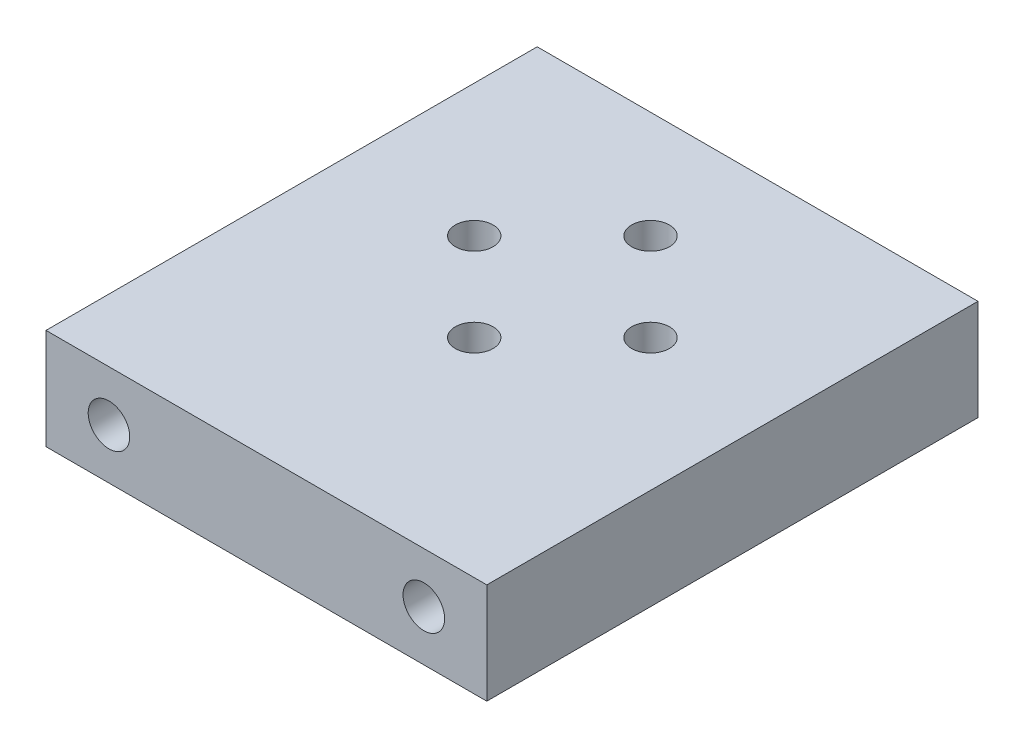
ISO-10303-21;
HEADER;
FILE_DESCRIPTION(('STEP AP214'),'2;1');
FILE_NAME('part.step','',(''),(''),'','','');
FILE_SCHEMA(('AUTOMOTIVE_DESIGN { 1 0 10303 214 1 1 1 1 }'));
ENDSEC;
DATA;
#1=APPLICATION_CONTEXT('core data for automotive mechanical design processes');
#2=APPLICATION_PROTOCOL_DEFINITION('international standard','automotive_design',2000,#1);
#3=PRODUCT_CONTEXT('',#1,'mechanical');
#4=PRODUCT('Part','Part','',(#3));
#5=PRODUCT_RELATED_PRODUCT_CATEGORY('part','',(#4));
#6=PRODUCT_DEFINITION_FORMATION('','',#4);
#7=PRODUCT_DEFINITION_CONTEXT('part definition',#1,'design');
#8=PRODUCT_DEFINITION('design','',#6,#7);
#9=PRODUCT_DEFINITION_SHAPE('','',#8);
#10=(LENGTH_UNIT() NAMED_UNIT(*) SI_UNIT(.MILLI.,.METRE.));
#11=(NAMED_UNIT(*) PLANE_ANGLE_UNIT() SI_UNIT($,.RADIAN.));
#12=(NAMED_UNIT(*) SI_UNIT($,.STERADIAN.) SOLID_ANGLE_UNIT());
#13=UNCERTAINTY_MEASURE_WITH_UNIT(LENGTH_MEASURE(1.E-05),#10,'distance_accuracy_value','');
#14=(GEOMETRIC_REPRESENTATION_CONTEXT(3) GLOBAL_UNCERTAINTY_ASSIGNED_CONTEXT((#13)) GLOBAL_UNIT_ASSIGNED_CONTEXT((#10,
#11,#12)) REPRESENTATION_CONTEXT('',''));
#15=CARTESIAN_POINT('',(0.,0.,0.));
#16=DIRECTION('',(0.,0.,1.));
#17=DIRECTION('',(1.,0.,0.));
#18=AXIS2_PLACEMENT_3D('',#15,#16,#17);
#19=CARTESIAN_POINT('',(0.,5.,-4.));
#20=DIRECTION('',(0.,1.,0.));
#21=DIRECTION('',(0.,0.,1.));
#22=AXIS2_PLACEMENT_3D('',#19,#20,#21);
#23=PLANE('',#22);
#24=CARTESIAN_POINT('',(0.,5.,-11.));
#25=DIRECTION('',(0.,-1.,0.));
#26=DIRECTION('',(0.,0.,-1.));
#27=AXIS2_PLACEMENT_3D('',#24,#25,#26);
#28=CIRCLE('',#27,1.5);
#29=CARTESIAN_POINT('',(1.5,5.,-11.));
#30=VERTEX_POINT('',#29);
#31=CARTESIAN_POINT('',(-1.5,5.,-11.));
#32=VERTEX_POINT('',#31);
#33=EDGE_CURVE('E314',#30,#32,#28,.T.);
#34=ORIENTED_EDGE('',*,*,#33,.F.);
#35=DIRECTION('',(0.,0.,1.));
#36=VECTOR('',#35,1.);
#37=CARTESIAN_POINT('',(1.5,5.,-11.));
#38=LINE('',#37,#36);
#39=CARTESIAN_POINT('',(1.5,5.,-9.29150262212918));
#40=VERTEX_POINT('',#39);
#41=EDGE_CURVE('E428',#30,#40,#38,.T.);
#42=ORIENTED_EDGE('',*,*,#41,.T.);
#43=CARTESIAN_POINT('',(0.,5.,-4.));
#44=DIRECTION('',(0.,1.,0.));
#45=DIRECTION('',(0.,0.,1.));
#46=AXIS2_PLACEMENT_3D('',#43,#44,#45);
#47=CIRCLE('',#46,5.5);
#48=CARTESIAN_POINT('',(5.29150262212917,5.,-5.50000000000006));
#49=VERTEX_POINT('',#48);
#50=EDGE_CURVE('E267',#49,#40,#47,.T.);
#51=ORIENTED_EDGE('',*,*,#50,.F.);
#52=DIRECTION('',(1.,0.,0.));
#53=VECTOR('',#52,1.);
#54=CARTESIAN_POINT('',(6.99999999999998,5.,-5.50000000000007));
#55=LINE('',#54,#53);
#56=CARTESIAN_POINT('',(6.99999999999998,5.,-5.50000000000007));
#57=VERTEX_POINT('',#56);
#58=EDGE_CURVE('E230',#49,#57,#55,.T.);
#59=ORIENTED_EDGE('',*,*,#58,.T.);
#60=CARTESIAN_POINT('',(7.,5.,-4.00000000000007));
#61=DIRECTION('',(0.,-1.,0.));
#62=DIRECTION('',(0.,0.,-1.));
#63=AXIS2_PLACEMENT_3D('',#60,#61,#62);
#64=CIRCLE('',#63,1.5);
#65=CARTESIAN_POINT('',(7.00000000000002,5.,-2.50000000000007));
#66=VERTEX_POINT('',#65);
#67=EDGE_CURVE('E425',#66,#57,#64,.T.);
#68=ORIENTED_EDGE('',*,*,#67,.F.);
#69=DIRECTION('',(-1.,0.,0.));
#70=VECTOR('',#69,1.);
#71=CARTESIAN_POINT('',(7.00000000000002,5.,-2.50000000000007));
#72=LINE('',#71,#70);
#73=CARTESIAN_POINT('',(5.2915026221292,5.,-2.50000000000006));
#74=VERTEX_POINT('',#73);
#75=EDGE_CURVE('E228',#66,#74,#72,.T.);
#76=ORIENTED_EDGE('',*,*,#75,.T.);
#77=CARTESIAN_POINT('',(1.50000000000004,5.,1.29150262212917));
#78=VERTEX_POINT('',#77);
#79=EDGE_CURVE('E263',#78,#74,#47,.T.);
#80=ORIENTED_EDGE('',*,*,#79,.F.);
#81=DIRECTION('',(0.,0.,1.));
#82=VECTOR('',#81,1.);
#83=CARTESIAN_POINT('',(1.50000000000005,5.,2.99999999999999));
#84=LINE('',#83,#82);
#85=CARTESIAN_POINT('',(1.50000000000005,5.,2.99999999999999));
#86=VERTEX_POINT('',#85);
#87=EDGE_CURVE('E213',#78,#86,#84,.T.);
#88=ORIENTED_EDGE('',*,*,#87,.T.);
#89=CARTESIAN_POINT('',(0.,5.,3.));
#90=DIRECTION('',(0.,-1.,0.));
#91=DIRECTION('',(0.,0.,-1.));
#92=AXIS2_PLACEMENT_3D('',#89,#90,#91);
#93=CIRCLE('',#92,1.5);
#94=CARTESIAN_POINT('',(-1.49999999999995,5.,3.00000000000001));
#95=VERTEX_POINT('',#94);
#96=EDGE_CURVE('E181',#95,#86,#93,.T.);
#97=ORIENTED_EDGE('',*,*,#96,.F.);
#98=DIRECTION('',(0.,0.,-1.));
#99=VECTOR('',#98,1.);
#100=CARTESIAN_POINT('',(-1.49999999999995,5.,3.00000000000001));
#101=LINE('',#100,#99);
#102=CARTESIAN_POINT('',(-1.49999999999996,5.,1.29150262212919));
#103=VERTEX_POINT('',#102);
#104=EDGE_CURVE('E54',#95,#103,#101,.T.);
#105=ORIENTED_EDGE('',*,*,#104,.T.);
#106=CARTESIAN_POINT('',(-5.29150262212918,5.,-2.49999999999998));
#107=VERTEX_POINT('',#106);
#108=EDGE_CURVE('E268',#107,#103,#47,.T.);
#109=ORIENTED_EDGE('',*,*,#108,.F.);
#110=DIRECTION('',(-1.,0.,0.));
#111=VECTOR('',#110,1.);
#112=CARTESIAN_POINT('',(-6.99999999999999,5.,-2.49999999999998));
#113=LINE('',#112,#111);
#114=CARTESIAN_POINT('',(-6.99999999999999,5.,-2.49999999999998));
#115=VERTEX_POINT('',#114);
#116=EDGE_CURVE('E177',#107,#115,#113,.T.);
#117=ORIENTED_EDGE('',*,*,#116,.T.);
#118=CARTESIAN_POINT('',(-7.,5.,-3.99999999999998));
#119=DIRECTION('',(0.,-1.,0.));
#120=DIRECTION('',(0.,0.,-1.));
#121=AXIS2_PLACEMENT_3D('',#118,#119,#120);
#122=CIRCLE('',#121,1.5);
#123=CARTESIAN_POINT('',(-7.,5.,-5.49999999999998));
#124=VERTEX_POINT('',#123);
#125=EDGE_CURVE('E175',#124,#115,#122,.T.);
#126=ORIENTED_EDGE('',*,*,#125,.F.);
#127=DIRECTION('',(1.,0.,0.));
#128=VECTOR('',#127,1.);
#129=CARTESIAN_POINT('',(-7.,5.,-5.49999999999998));
#130=LINE('',#129,#128);
#131=CARTESIAN_POINT('',(-5.29150262212919,5.,-5.49999999999998));
#132=VERTEX_POINT('',#131);
#133=EDGE_CURVE('E61',#124,#132,#130,.T.);
#134=ORIENTED_EDGE('',*,*,#133,.T.);
#135=CARTESIAN_POINT('',(-1.5,5.,-9.29150262212918));
#136=VERTEX_POINT('',#135);
#137=EDGE_CURVE('E490',#136,#132,#47,.T.);
#138=ORIENTED_EDGE('',*,*,#137,.F.);
#139=DIRECTION('',(0.,0.,-1.));
#140=VECTOR('',#139,1.);
#141=CARTESIAN_POINT('',(-1.5,5.,-11.));
#142=LINE('',#141,#140);
#143=EDGE_CURVE('E430',#136,#32,#142,.T.);
#144=ORIENTED_EDGE('',*,*,#143,.T.);
#145=EDGE_LOOP('',(#34,#42,#51,#59,#68,#76,#80,#88,#97,#105,#109,#117,#126,#134,#138,#144));
#146=FACE_BOUND('',#145,.T.);
#147=ADVANCED_FACE('F37',(#146),#23,.F.);
#148=CARTESIAN_POINT('',(0.,5.,-4.));
#149=DIRECTION('',(0.,-1.,0.));
#150=DIRECTION('',(0.,0.,-1.));
#151=AXIS2_PLACEMENT_3D('',#148,#149,#150);
#152=CYLINDRICAL_SURFACE('',#151,5.5);
#153=DIRECTION('',(0.,-1.,0.));
#154=VECTOR('',#153,1.);
#155=CARTESIAN_POINT('',(-1.5,5.,-9.29150262212918));
#156=LINE('',#155,#154);
#157=CARTESIAN_POINT('',(-1.5,0.,-9.29150262212918));
#158=VERTEX_POINT('',#157);
#159=EDGE_CURVE('E260',#136,#158,#156,.T.);
#160=ORIENTED_EDGE('',*,*,#159,.F.);
#161=ORIENTED_EDGE('',*,*,#137,.T.);
#162=DIRECTION('',(0.,-1.,0.));
#163=VECTOR('',#162,1.);
#164=CARTESIAN_POINT('',(-5.29150262212919,5.,-5.49999999999998));
#165=LINE('',#164,#163);
#166=CARTESIAN_POINT('',(-5.29150262212919,0.,-5.49999999999998));
#167=VERTEX_POINT('',#166);
#168=EDGE_CURVE('E196',#167,#132,#165,.F.);
#169=ORIENTED_EDGE('',*,*,#168,.F.);
#170=CARTESIAN_POINT('',(0.,0.,-4.));
#171=DIRECTION('',(0.,1.,0.));
#172=DIRECTION('',(0.,0.,1.));
#173=AXIS2_PLACEMENT_3D('',#170,#171,#172);
#174=CIRCLE('',#173,5.5);
#175=EDGE_CURVE('E453',#158,#167,#174,.T.);
#176=ORIENTED_EDGE('',*,*,#175,.F.);
#177=EDGE_LOOP('',(#160,#161,#169,#176));
#178=FACE_BOUND('',#177,.T.);
#179=ADVANCED_FACE('F366',(#178),#152,.F.);
#180=DIRECTION('',(0.,-1.,0.));
#181=VECTOR('',#180,1.);
#182=CARTESIAN_POINT('',(-5.29150262212918,5.,-2.49999999999998));
#183=LINE('',#182,#181);
#184=CARTESIAN_POINT('',(-5.29150262212918,0.,-2.49999999999998));
#185=VERTEX_POINT('',#184);
#186=EDGE_CURVE('E255',#107,#185,#183,.T.);
#187=ORIENTED_EDGE('',*,*,#186,.F.);
#188=ORIENTED_EDGE('',*,*,#108,.T.);
#189=DIRECTION('',(0.,-1.,0.));
#190=VECTOR('',#189,1.);
#191=CARTESIAN_POINT('',(-1.49999999999996,5.,1.29150262212919));
#192=LINE('',#191,#190);
#193=CARTESIAN_POINT('',(-1.49999999999996,0.,1.29150262212919));
#194=VERTEX_POINT('',#193);
#195=EDGE_CURVE('E250',#194,#103,#192,.F.);
#196=ORIENTED_EDGE('',*,*,#195,.F.);
#197=EDGE_CURVE('E262',#185,#194,#174,.T.);
#198=ORIENTED_EDGE('',*,*,#197,.F.);
#199=EDGE_LOOP('',(#187,#188,#196,#198));
#200=FACE_BOUND('',#199,.T.);
#201=ADVANCED_FACE('F371',(#200),#152,.F.);
#202=DIRECTION('',(0.,-1.,0.));
#203=VECTOR('',#202,1.);
#204=CARTESIAN_POINT('',(1.50000000000004,5.,1.29150262212917));
#205=LINE('',#204,#203);
#206=CARTESIAN_POINT('',(1.50000000000004,0.,1.29150262212917));
#207=VERTEX_POINT('',#206);
#208=EDGE_CURVE('E252',#78,#207,#205,.T.);
#209=ORIENTED_EDGE('',*,*,#208,.F.);
#210=ORIENTED_EDGE('',*,*,#79,.T.);
#211=DIRECTION('',(0.,-1.,0.));
#212=VECTOR('',#211,1.);
#213=CARTESIAN_POINT('',(5.2915026221292,5.,-2.50000000000006));
#214=LINE('',#213,#212);
#215=CARTESIAN_POINT('',(5.2915026221292,0.,-2.50000000000006));
#216=VERTEX_POINT('',#215);
#217=EDGE_CURVE('E244',#216,#74,#214,.F.);
#218=ORIENTED_EDGE('',*,*,#217,.F.);
#219=EDGE_CURVE('E269',#207,#216,#174,.T.);
#220=ORIENTED_EDGE('',*,*,#219,.F.);
#221=EDGE_LOOP('',(#209,#210,#218,#220));
#222=FACE_BOUND('',#221,.T.);
#223=ADVANCED_FACE('F382',(#222),#152,.F.);
#224=CARTESIAN_POINT('',(17.5,8.,-19.5));
#225=DIRECTION('',(-1.,0.,0.));
#226=DIRECTION('',(0.,0.,1.));
#227=AXIS2_PLACEMENT_3D('',#224,#225,#226);
#228=PLANE('',#227);
#229=DIRECTION('',(0.,0.,-1.));
#230=VECTOR('',#229,1.);
#231=CARTESIAN_POINT('',(17.5,0.,-19.5));
#232=LINE('',#231,#230);
#233=CARTESIAN_POINT('',(17.5,0.,19.5));
#234=VERTEX_POINT('',#233);
#235=CARTESIAN_POINT('',(17.5,0.,-19.5));
#236=VERTEX_POINT('',#235);
#237=EDGE_CURVE('E276',#234,#236,#232,.T.);
#238=ORIENTED_EDGE('',*,*,#237,.T.);
#239=DIRECTION('',(0.,-1.,0.));
#240=VECTOR('',#239,1.);
#241=CARTESIAN_POINT('',(17.5,8.,-19.5));
#242=LINE('',#241,#240);
#243=CARTESIAN_POINT('',(17.5,8.,-19.5));
#244=VERTEX_POINT('',#243);
#245=EDGE_CURVE('E11',#244,#236,#242,.T.);
#246=ORIENTED_EDGE('',*,*,#245,.F.);
#247=DIRECTION('',(0.,0.,-1.));
#248=VECTOR('',#247,1.);
#249=CARTESIAN_POINT('',(17.5,8.,-19.5));
#250=LINE('',#249,#248);
#251=CARTESIAN_POINT('',(17.5,8.,19.5));
#252=VERTEX_POINT('',#251);
#253=EDGE_CURVE('E285',#252,#244,#250,.T.);
#254=ORIENTED_EDGE('',*,*,#253,.F.);
#255=DIRECTION('',(0.,-1.,0.));
#256=VECTOR('',#255,1.);
#257=CARTESIAN_POINT('',(17.5,8.,19.5));
#258=LINE('',#257,#256);
#259=EDGE_CURVE('E295',#252,#234,#258,.T.);
#260=ORIENTED_EDGE('',*,*,#259,.T.);
#261=EDGE_LOOP('',(#238,#246,#254,#260));
#262=FACE_BOUND('',#261,.T.);
#263=ADVANCED_FACE('F39',(#262),#228,.F.);
#264=CARTESIAN_POINT('',(-17.5,8.,-19.5));
#265=DIRECTION('',(0.,0.,1.));
#266=DIRECTION('',(1.,0.,0.));
#267=AXIS2_PLACEMENT_3D('',#264,#265,#266);
#268=PLANE('',#267);
#269=CARTESIAN_POINT('',(-12.5,4.,-19.5));
#270=DIRECTION('',(0.,0.,-1.));
#271=DIRECTION('',(-1.,0.,0.));
#272=AXIS2_PLACEMENT_3D('',#269,#270,#271);
#273=CIRCLE('',#272,1.65);
#274=CARTESIAN_POINT('',(-14.15,4.,-19.5));
#275=VERTEX_POINT('',#274);
#276=EDGE_CURVE('E277',#275,#275,#273,.T.);
#277=ORIENTED_EDGE('',*,*,#276,.F.);
#278=EDGE_LOOP('',(#277));
#279=FACE_BOUND('',#278,.T.);
#280=CARTESIAN_POINT('',(12.5,3.99999999999999,-19.5));
#281=DIRECTION('',(0.,0.,-1.));
#282=DIRECTION('',(1.,0.,0.));
#283=AXIS2_PLACEMENT_3D('',#280,#281,#282);
#284=CIRCLE('',#283,1.65);
#285=CARTESIAN_POINT('',(14.15,3.99999999999999,-19.5));
#286=VERTEX_POINT('',#285);
#287=EDGE_CURVE('E266',#286,#286,#284,.T.);
#288=ORIENTED_EDGE('',*,*,#287,.F.);
#289=EDGE_LOOP('',(#288));
#290=FACE_BOUND('',#289,.T.);
#291=DIRECTION('',(-1.,0.,0.));
#292=VECTOR('',#291,1.);
#293=CARTESIAN_POINT('',(-17.5,0.,-19.5));
#294=LINE('',#293,#292);
#295=CARTESIAN_POINT('',(-17.5,0.,-19.5));
#296=VERTEX_POINT('',#295);
#297=EDGE_CURVE('E298',#236,#296,#294,.T.);
#298=ORIENTED_EDGE('',*,*,#297,.T.);
#299=DIRECTION('',(0.,-1.,0.));
#300=VECTOR('',#299,1.);
#301=CARTESIAN_POINT('',(-17.5,8.,-19.5));
#302=LINE('',#301,#300);
#303=CARTESIAN_POINT('',(-17.5,8.,-19.5));
#304=VERTEX_POINT('',#303);
#305=EDGE_CURVE('E46',#304,#296,#302,.T.);
#306=ORIENTED_EDGE('',*,*,#305,.F.);
#307=DIRECTION('',(-1.,0.,0.));
#308=VECTOR('',#307,1.);
#309=CARTESIAN_POINT('',(-17.5,8.,-19.5));
#310=LINE('',#309,#308);
#311=EDGE_CURVE('E288',#244,#304,#310,.T.);
#312=ORIENTED_EDGE('',*,*,#311,.F.);
#313=ORIENTED_EDGE('',*,*,#245,.T.);
#314=EDGE_LOOP('',(#298,#306,#312,#313));
#315=FACE_BOUND('',#314,.T.);
#316=ADVANCED_FACE('F344',(#279,#290,#315),#268,.F.);
#317=CARTESIAN_POINT('',(-17.5,8.,-19.5));
#318=DIRECTION('',(1.,0.,0.));
#319=DIRECTION('',(0.,0.,-1.));
#320=AXIS2_PLACEMENT_3D('',#317,#318,#319);
#321=PLANE('',#320);
#322=DIRECTION('',(0.,0.,1.));
#323=VECTOR('',#322,1.);
#324=CARTESIAN_POINT('',(-17.5,0.,-19.5));
#325=LINE('',#324,#323);
#326=CARTESIAN_POINT('',(-17.5,0.,19.5));
#327=VERTEX_POINT('',#326);
#328=EDGE_CURVE('E300',#296,#327,#325,.T.);
#329=ORIENTED_EDGE('',*,*,#328,.T.);
#330=DIRECTION('',(0.,-1.,0.));
#331=VECTOR('',#330,1.);
#332=CARTESIAN_POINT('',(-17.5,8.,19.5));
#333=LINE('',#332,#331);
#334=CARTESIAN_POINT('',(-17.5,8.,19.5));
#335=VERTEX_POINT('',#334);
#336=EDGE_CURVE('E305',#335,#327,#333,.T.);
#337=ORIENTED_EDGE('',*,*,#336,.F.);
#338=DIRECTION('',(0.,0.,1.));
#339=VECTOR('',#338,1.);
#340=CARTESIAN_POINT('',(-17.5,8.,-19.5));
#341=LINE('',#340,#339);
#342=EDGE_CURVE('E291',#304,#335,#341,.T.);
#343=ORIENTED_EDGE('',*,*,#342,.F.);
#344=ORIENTED_EDGE('',*,*,#305,.T.);
#345=EDGE_LOOP('',(#329,#337,#343,#344));
#346=FACE_BOUND('',#345,.T.);
#347=ADVANCED_FACE('F349',(#346),#321,.F.);
#348=CARTESIAN_POINT('',(-17.5,8.,19.5));
#349=DIRECTION('',(0.,0.,-1.));
#350=DIRECTION('',(-1.,0.,0.));
#351=AXIS2_PLACEMENT_3D('',#348,#349,#350);
#352=PLANE('',#351);
#353=CARTESIAN_POINT('',(-12.5,4.,19.5));
#354=DIRECTION('',(0.,0.,1.));
#355=DIRECTION('',(1.,0.,0.));
#356=AXIS2_PLACEMENT_3D('',#353,#354,#355);
#357=CIRCLE('',#356,1.65);
#358=CARTESIAN_POINT('',(-10.85,4.,19.5));
#359=VERTEX_POINT('',#358);
#360=EDGE_CURVE('E413',#359,#359,#357,.T.);
#361=ORIENTED_EDGE('',*,*,#360,.F.);
#362=EDGE_LOOP('',(#361));
#363=FACE_BOUND('',#362,.T.);
#364=CARTESIAN_POINT('',(12.5,4.,19.5));
#365=DIRECTION('',(0.,0.,1.));
#366=DIRECTION('',(-1.,0.,0.));
#367=AXIS2_PLACEMENT_3D('',#364,#365,#366);
#368=CIRCLE('',#367,1.65);
#369=CARTESIAN_POINT('',(10.85,4.,19.5));
#370=VERTEX_POINT('',#369);
#371=EDGE_CURVE('E416',#370,#370,#368,.T.);
#372=ORIENTED_EDGE('',*,*,#371,.F.);
#373=EDGE_LOOP('',(#372));
#374=FACE_BOUND('',#373,.T.);
#375=DIRECTION('',(1.,0.,0.));
#376=VECTOR('',#375,1.);
#377=CARTESIAN_POINT('',(-17.5,0.,19.5));
#378=LINE('',#377,#376);
#379=EDGE_CURVE('E289',#327,#234,#378,.T.);
#380=ORIENTED_EDGE('',*,*,#379,.T.);
#381=ORIENTED_EDGE('',*,*,#259,.F.);
#382=DIRECTION('',(1.,0.,0.));
#383=VECTOR('',#382,1.);
#384=CARTESIAN_POINT('',(-17.5,8.,19.5));
#385=LINE('',#384,#383);
#386=EDGE_CURVE('E293',#335,#252,#385,.T.);
#387=ORIENTED_EDGE('',*,*,#386,.F.);
#388=ORIENTED_EDGE('',*,*,#336,.T.);
#389=EDGE_LOOP('',(#380,#381,#387,#388));
#390=FACE_BOUND('',#389,.T.);
#391=ADVANCED_FACE('F329',(#363,#374,#390),#352,.F.);
#392=CARTESIAN_POINT('',(0.,8.,0.));
#393=DIRECTION('',(0.,1.,0.));
#394=DIRECTION('',(0.,0.,1.));
#395=AXIS2_PLACEMENT_3D('',#392,#393,#394);
#396=PLANE('',#395);
#397=CARTESIAN_POINT('',(0.,8.,-11.));
#398=DIRECTION('',(0.,1.,0.));
#399=DIRECTION('',(0.,0.,1.));
#400=AXIS2_PLACEMENT_3D('',#397,#398,#399);
#401=CIRCLE('',#400,1.5);
#402=CARTESIAN_POINT('',(0.,8.,-9.5));
#403=VERTEX_POINT('',#402);
#404=EDGE_CURVE('E41',#403,#403,#401,.T.);
#405=ORIENTED_EDGE('',*,*,#404,.F.);
#406=EDGE_LOOP('',(#405));
#407=FACE_BOUND('',#406,.T.);
#408=CARTESIAN_POINT('',(7.,8.,-4.00000000000007));
#409=DIRECTION('',(0.,1.,0.));
#410=DIRECTION('',(0.,0.,1.));
#411=AXIS2_PLACEMENT_3D('',#408,#409,#410);
#412=CIRCLE('',#411,1.5);
#413=CARTESIAN_POINT('',(7.,8.,-2.50000000000007));
#414=VERTEX_POINT('',#413);
#415=EDGE_CURVE('E316',#414,#414,#412,.T.);
#416=ORIENTED_EDGE('',*,*,#415,.F.);
#417=EDGE_LOOP('',(#416));
#418=FACE_BOUND('',#417,.T.);
#419=CARTESIAN_POINT('',(0.,8.,3.));
#420=DIRECTION('',(0.,1.,0.));
#421=DIRECTION('',(0.,0.,1.));
#422=AXIS2_PLACEMENT_3D('',#419,#420,#421);
#423=CIRCLE('',#422,1.5);
#424=CARTESIAN_POINT('',(0.,8.,4.5));
#425=VERTEX_POINT('',#424);
#426=EDGE_CURVE('E313',#425,#425,#423,.T.);
#427=ORIENTED_EDGE('',*,*,#426,.F.);
#428=EDGE_LOOP('',(#427));
#429=FACE_BOUND('',#428,.T.);
#430=CARTESIAN_POINT('',(-7.,8.,-3.99999999999998));
#431=DIRECTION('',(0.,1.,0.));
#432=DIRECTION('',(0.,0.,1.));
#433=AXIS2_PLACEMENT_3D('',#430,#431,#432);
#434=CIRCLE('',#433,1.5);
#435=CARTESIAN_POINT('',(-7.,8.,-2.49999999999998));
#436=VERTEX_POINT('',#435);
#437=EDGE_CURVE('E310',#436,#436,#434,.T.);
#438=ORIENTED_EDGE('',*,*,#437,.F.);
#439=EDGE_LOOP('',(#438));
#440=FACE_BOUND('',#439,.T.);
#441=ORIENTED_EDGE('',*,*,#253,.T.);
#442=ORIENTED_EDGE('',*,*,#311,.T.);
#443=ORIENTED_EDGE('',*,*,#342,.T.);
#444=ORIENTED_EDGE('',*,*,#386,.T.);
#445=EDGE_LOOP('',(#441,#442,#443,#444));
#446=FACE_BOUND('',#445,.T.);
#447=ADVANCED_FACE('F325',(#407,#418,#429,#440,#446),#396,.T.);
#448=CARTESIAN_POINT('',(0.,0.,0.));
#449=DIRECTION('',(0.,1.,0.));
#450=DIRECTION('',(0.,0.,1.));
#451=AXIS2_PLACEMENT_3D('',#448,#449,#450);
#452=PLANE('',#451);
#453=CARTESIAN_POINT('',(0.,0.,-11.));
#454=DIRECTION('',(0.,-1.,0.));
#455=DIRECTION('',(0.,0.,-1.));
#456=AXIS2_PLACEMENT_3D('',#453,#454,#455);
#457=CIRCLE('',#456,1.5);
#458=CARTESIAN_POINT('',(-1.5,0.,-11.));
#459=VERTEX_POINT('',#458);
#460=CARTESIAN_POINT('',(1.5,0.,-11.));
#461=VERTEX_POINT('',#460);
#462=EDGE_CURVE('E210',#459,#461,#457,.T.);
#463=ORIENTED_EDGE('',*,*,#462,.F.);
#464=DIRECTION('',(0.,0.,-1.));
#465=VECTOR('',#464,1.);
#466=CARTESIAN_POINT('',(-1.5,0.,-11.));
#467=LINE('',#466,#465);
#468=EDGE_CURVE('E431',#158,#459,#467,.T.);
#469=ORIENTED_EDGE('',*,*,#468,.F.);
#470=ORIENTED_EDGE('',*,*,#175,.T.);
#471=DIRECTION('',(1.,0.,0.));
#472=VECTOR('',#471,1.);
#473=CARTESIAN_POINT('',(-7.,0.,-5.49999999999998));
#474=LINE('',#473,#472);
#475=CARTESIAN_POINT('',(-7.,0.,-5.49999999999998));
#476=VERTEX_POINT('',#475);
#477=EDGE_CURVE('E201',#476,#167,#474,.T.);
#478=ORIENTED_EDGE('',*,*,#477,.F.);
#479=CARTESIAN_POINT('',(-7.,0.,-3.99999999999998));
#480=DIRECTION('',(0.,-1.,0.));
#481=DIRECTION('',(0.,0.,-1.));
#482=AXIS2_PLACEMENT_3D('',#479,#480,#481);
#483=CIRCLE('',#482,1.5);
#484=CARTESIAN_POINT('',(-6.99999999999999,0.,-2.49999999999998));
#485=VERTEX_POINT('',#484);
#486=EDGE_CURVE('E189',#485,#476,#483,.T.);
#487=ORIENTED_EDGE('',*,*,#486,.F.);
#488=DIRECTION('',(-1.,0.,0.));
#489=VECTOR('',#488,1.);
#490=CARTESIAN_POINT('',(-6.99999999999999,0.,-2.49999999999998));
#491=LINE('',#490,#489);
#492=EDGE_CURVE('E198',#185,#485,#491,.T.);
#493=ORIENTED_EDGE('',*,*,#492,.F.);
#494=ORIENTED_EDGE('',*,*,#197,.T.);
#495=DIRECTION('',(0.,0.,-1.));
#496=VECTOR('',#495,1.);
#497=CARTESIAN_POINT('',(-1.49999999999995,0.,3.00000000000001));
#498=LINE('',#497,#496);
#499=CARTESIAN_POINT('',(-1.49999999999995,0.,3.00000000000001));
#500=VERTEX_POINT('',#499);
#501=EDGE_CURVE('E221',#500,#194,#498,.T.);
#502=ORIENTED_EDGE('',*,*,#501,.F.);
#503=CARTESIAN_POINT('',(0.,0.,3.));
#504=DIRECTION('',(0.,-1.,0.));
#505=DIRECTION('',(0.,0.,-1.));
#506=AXIS2_PLACEMENT_3D('',#503,#504,#505);
#507=CIRCLE('',#506,1.5);
#508=CARTESIAN_POINT('',(1.50000000000005,0.,2.99999999999999));
#509=VERTEX_POINT('',#508);
#510=EDGE_CURVE('E218',#509,#500,#507,.T.);
#511=ORIENTED_EDGE('',*,*,#510,.F.);
#512=DIRECTION('',(0.,0.,1.));
#513=VECTOR('',#512,1.);
#514=CARTESIAN_POINT('',(1.50000000000005,0.,2.99999999999999));
#515=LINE('',#514,#513);
#516=EDGE_CURVE('E214',#207,#509,#515,.T.);
#517=ORIENTED_EDGE('',*,*,#516,.F.);
#518=ORIENTED_EDGE('',*,*,#219,.T.);
#519=DIRECTION('',(-1.,0.,0.));
#520=VECTOR('',#519,1.);
#521=CARTESIAN_POINT('',(7.00000000000002,0.,-2.50000000000007));
#522=LINE('',#521,#520);
#523=CARTESIAN_POINT('',(7.00000000000002,0.,-2.50000000000007));
#524=VERTEX_POINT('',#523);
#525=EDGE_CURVE('E238',#524,#216,#522,.T.);
#526=ORIENTED_EDGE('',*,*,#525,.F.);
#527=CARTESIAN_POINT('',(7.,0.,-4.00000000000007));
#528=DIRECTION('',(0.,-1.,0.));
#529=DIRECTION('',(0.,0.,-1.));
#530=AXIS2_PLACEMENT_3D('',#527,#528,#529);
#531=CIRCLE('',#530,1.5);
#532=CARTESIAN_POINT('',(6.99999999999998,0.,-5.50000000000007));
#533=VERTEX_POINT('',#532);
#534=EDGE_CURVE('E235',#533,#524,#531,.T.);
#535=ORIENTED_EDGE('',*,*,#534,.F.);
#536=DIRECTION('',(1.,0.,0.));
#537=VECTOR('',#536,1.);
#538=CARTESIAN_POINT('',(6.99999999999998,0.,-5.50000000000007));
#539=LINE('',#538,#537);
#540=CARTESIAN_POINT('',(5.29150262212917,0.,-5.50000000000006));
#541=VERTEX_POINT('',#540);
#542=EDGE_CURVE('E231',#541,#533,#539,.T.);
#543=ORIENTED_EDGE('',*,*,#542,.F.);
#544=CARTESIAN_POINT('',(1.5,0.,-9.29150262212918));
#545=VERTEX_POINT('',#544);
#546=EDGE_CURVE('E272',#541,#545,#174,.T.);
#547=ORIENTED_EDGE('',*,*,#546,.T.);
#548=DIRECTION('',(0.,0.,1.));
#549=VECTOR('',#548,1.);
#550=CARTESIAN_POINT('',(1.5,0.,-11.));
#551=LINE('',#550,#549);
#552=EDGE_CURVE('E436',#461,#545,#551,.T.);
#553=ORIENTED_EDGE('',*,*,#552,.F.);
#554=EDGE_LOOP('',(#463,#469,#470,#478,#487,#493,#494,#502,#511,#517,#518,#526,#535,#543,#547,#553));
#555=FACE_BOUND('',#554,.T.);
#556=ORIENTED_EDGE('',*,*,#237,.F.);
#557=ORIENTED_EDGE('',*,*,#379,.F.);
#558=ORIENTED_EDGE('',*,*,#328,.F.);
#559=ORIENTED_EDGE('',*,*,#297,.F.);
#560=EDGE_LOOP('',(#556,#557,#558,#559));
#561=FACE_BOUND('',#560,.T.);
#562=ADVANCED_FACE('F328',(#555,#561),#452,.F.);
#563=CARTESIAN_POINT('',(12.5,3.99999999999999,-7.5));
#564=DIRECTION('',(0.,0.,-1.));
#565=DIRECTION('',(-1.,0.,0.));
#566=AXIS2_PLACEMENT_3D('',#563,#564,#565);
#567=CYLINDRICAL_SURFACE('',#566,1.65);
#568=CARTESIAN_POINT('',(12.5,3.99999999999999,-7.5));
#569=DIRECTION('',(0.,0.,-1.));
#570=DIRECTION('',(1.,0.,0.));
#571=AXIS2_PLACEMENT_3D('',#568,#569,#570);
#572=CIRCLE('',#571,1.65);
#573=CARTESIAN_POINT('',(14.15,3.99999999999999,-7.5));
#574=VERTEX_POINT('',#573);
#575=EDGE_CURVE('E280',#574,#574,#572,.T.);
#576=ORIENTED_EDGE('',*,*,#575,.F.);
#577=EDGE_LOOP('',(#576));
#578=FACE_BOUND('',#577,.T.);
#579=ORIENTED_EDGE('',*,*,#287,.T.);
#580=EDGE_LOOP('',(#579));
#581=FACE_BOUND('',#580,.T.);
#582=ADVANCED_FACE('F354',(#578,#581),#567,.F.);
#583=CARTESIAN_POINT('',(12.5,3.99999999999999,-7.5));
#584=DIRECTION('',(0.,0.,1.));
#585=DIRECTION('',(1.,0.,0.));
#586=AXIS2_PLACEMENT_3D('',#583,#584,#585);
#587=PLANE('',#586);
#588=ORIENTED_EDGE('',*,*,#575,.T.);
#589=EDGE_LOOP('',(#588));
#590=FACE_BOUND('',#589,.T.);
#591=ADVANCED_FACE('F360',(#590),#587,.F.);
#592=CARTESIAN_POINT('',(-12.5,4.,-7.5));
#593=DIRECTION('',(0.,0.,-1.));
#594=DIRECTION('',(-1.,0.,0.));
#595=AXIS2_PLACEMENT_3D('',#592,#593,#594);
#596=CYLINDRICAL_SURFACE('',#595,1.65);
#597=CARTESIAN_POINT('',(-12.5,4.,-7.5));
#598=DIRECTION('',(0.,0.,-1.));
#599=DIRECTION('',(-1.,0.,0.));
#600=AXIS2_PLACEMENT_3D('',#597,#598,#599);
#601=CIRCLE('',#600,1.65);
#602=CARTESIAN_POINT('',(-14.15,4.,-7.5));
#603=VERTEX_POINT('',#602);
#604=EDGE_CURVE('E273',#603,#603,#601,.T.);
#605=ORIENTED_EDGE('',*,*,#604,.F.);
#606=EDGE_LOOP('',(#605));
#607=FACE_BOUND('',#606,.T.);
#608=ORIENTED_EDGE('',*,*,#276,.T.);
#609=EDGE_LOOP('',(#608));
#610=FACE_BOUND('',#609,.T.);
#611=ADVANCED_FACE('F385',(#607,#610),#596,.F.);
#612=CARTESIAN_POINT('',(-12.5,4.,-7.5));
#613=DIRECTION('',(0.,0.,-1.));
#614=DIRECTION('',(-1.,0.,0.));
#615=AXIS2_PLACEMENT_3D('',#612,#613,#614);
#616=PLANE('',#615);
#617=ORIENTED_EDGE('',*,*,#604,.T.);
#618=EDGE_LOOP('',(#617));
#619=FACE_BOUND('',#618,.T.);
#620=ADVANCED_FACE('F380',(#619),#616,.T.);
#621=DIRECTION('',(0.,-1.,0.));
#622=VECTOR('',#621,1.);
#623=CARTESIAN_POINT('',(1.5,5.,-9.29150262212918));
#624=LINE('',#623,#622);
#625=EDGE_CURVE('E257',#545,#40,#624,.F.);
#626=ORIENTED_EDGE('',*,*,#625,.F.);
#627=ORIENTED_EDGE('',*,*,#546,.F.);
#628=DIRECTION('',(0.,-1.,0.));
#629=VECTOR('',#628,1.);
#630=CARTESIAN_POINT('',(5.29150262212917,5.,-5.50000000000006));
#631=LINE('',#630,#629);
#632=EDGE_CURVE('E247',#49,#541,#631,.T.);
#633=ORIENTED_EDGE('',*,*,#632,.F.);
#634=ORIENTED_EDGE('',*,*,#50,.T.);
#635=EDGE_LOOP('',(#626,#627,#633,#634));
#636=FACE_BOUND('',#635,.T.);
#637=ADVANCED_FACE('F374',(#636),#152,.F.);
#638=CARTESIAN_POINT('',(7.,5.,-4.00000000000007));
#639=DIRECTION('',(0.,-1.,0.));
#640=DIRECTION('',(0.,0.,-1.));
#641=AXIS2_PLACEMENT_3D('',#638,#639,#640);
#642=CYLINDRICAL_SURFACE('',#641,1.5);
#643=ORIENTED_EDGE('',*,*,#534,.T.);
#644=DIRECTION('',(0.,-1.,0.));
#645=VECTOR('',#644,1.);
#646=CARTESIAN_POINT('',(7.00000000000002,5.,-2.50000000000007));
#647=LINE('',#646,#645);
#648=EDGE_CURVE('E234',#66,#524,#647,.T.);
#649=ORIENTED_EDGE('',*,*,#648,.F.);
#650=ORIENTED_EDGE('',*,*,#67,.T.);
#651=DIRECTION('',(0.,-1.,0.));
#652=VECTOR('',#651,1.);
#653=CARTESIAN_POINT('',(6.99999999999998,5.,-5.50000000000007));
#654=LINE('',#653,#652);
#655=EDGE_CURVE('E222',#57,#533,#654,.T.);
#656=ORIENTED_EDGE('',*,*,#655,.T.);
#657=EDGE_LOOP('',(#643,#649,#650,#656));
#658=FACE_BOUND('',#657,.T.);
#659=ORIENTED_EDGE('',*,*,#415,.T.);
#660=EDGE_LOOP('',(#659));
#661=FACE_BOUND('',#660,.T.);
#662=ADVANCED_FACE('F376',(#658,#661),#642,.F.);
#663=CARTESIAN_POINT('',(6.99999999999998,5.,-5.50000000000007));
#664=DIRECTION('',(0.,0.,-1.));
#665=DIRECTION('',(-1.,0.,0.));
#666=AXIS2_PLACEMENT_3D('',#663,#664,#665);
#667=PLANE('',#666);
#668=ORIENTED_EDGE('',*,*,#632,.T.);
#669=ORIENTED_EDGE('',*,*,#542,.T.);
#670=ORIENTED_EDGE('',*,*,#655,.F.);
#671=ORIENTED_EDGE('',*,*,#58,.F.);
#672=EDGE_LOOP('',(#668,#669,#670,#671));
#673=FACE_BOUND('',#672,.T.);
#674=ADVANCED_FACE('F487',(#673),#667,.F.);
#675=CARTESIAN_POINT('',(7.00000000000002,5.,-2.50000000000007));
#676=DIRECTION('',(0.,0.,1.));
#677=DIRECTION('',(1.,0.,0.));
#678=AXIS2_PLACEMENT_3D('',#675,#676,#677);
#679=PLANE('',#678);
#680=ORIENTED_EDGE('',*,*,#217,.T.);
#681=ORIENTED_EDGE('',*,*,#75,.F.);
#682=ORIENTED_EDGE('',*,*,#648,.T.);
#683=ORIENTED_EDGE('',*,*,#525,.T.);
#684=EDGE_LOOP('',(#680,#681,#682,#683));
#685=FACE_BOUND('',#684,.T.);
#686=ADVANCED_FACE('F482',(#685),#679,.F.);
#687=CARTESIAN_POINT('',(0.,5.,3.));
#688=DIRECTION('',(0.,-1.,0.));
#689=DIRECTION('',(0.,0.,-1.));
#690=AXIS2_PLACEMENT_3D('',#687,#688,#689);
#691=CYLINDRICAL_SURFACE('',#690,1.5);
#692=ORIENTED_EDGE('',*,*,#510,.T.);
#693=DIRECTION('',(0.,-1.,0.));
#694=VECTOR('',#693,1.);
#695=CARTESIAN_POINT('',(-1.49999999999995,5.,3.00000000000001));
#696=LINE('',#695,#694);
#697=EDGE_CURVE('E217',#95,#500,#696,.T.);
#698=ORIENTED_EDGE('',*,*,#697,.F.);
#699=ORIENTED_EDGE('',*,*,#96,.T.);
#700=DIRECTION('',(0.,-1.,0.));
#701=VECTOR('',#700,1.);
#702=CARTESIAN_POINT('',(1.50000000000005,5.,2.99999999999999));
#703=LINE('',#702,#701);
#704=EDGE_CURVE('E208',#86,#509,#703,.T.);
#705=ORIENTED_EDGE('',*,*,#704,.T.);
#706=EDGE_LOOP('',(#692,#698,#699,#705));
#707=FACE_BOUND('',#706,.T.);
#708=ORIENTED_EDGE('',*,*,#426,.T.);
#709=EDGE_LOOP('',(#708));
#710=FACE_BOUND('',#709,.T.);
#711=ADVANCED_FACE('F469',(#707,#710),#691,.F.);
#712=CARTESIAN_POINT('',(1.50000000000005,5.,2.99999999999999));
#713=DIRECTION('',(1.,0.,0.));
#714=DIRECTION('',(0.,0.,-1.));
#715=AXIS2_PLACEMENT_3D('',#712,#713,#714);
#716=PLANE('',#715);
#717=ORIENTED_EDGE('',*,*,#208,.T.);
#718=ORIENTED_EDGE('',*,*,#516,.T.);
#719=ORIENTED_EDGE('',*,*,#704,.F.);
#720=ORIENTED_EDGE('',*,*,#87,.F.);
#721=EDGE_LOOP('',(#717,#718,#719,#720));
#722=FACE_BOUND('',#721,.T.);
#723=ADVANCED_FACE('F514',(#722),#716,.F.);
#724=CARTESIAN_POINT('',(-1.49999999999995,5.,3.00000000000001));
#725=DIRECTION('',(-1.,0.,0.));
#726=DIRECTION('',(0.,0.,1.));
#727=AXIS2_PLACEMENT_3D('',#724,#725,#726);
#728=PLANE('',#727);
#729=ORIENTED_EDGE('',*,*,#195,.T.);
#730=ORIENTED_EDGE('',*,*,#104,.F.);
#731=ORIENTED_EDGE('',*,*,#697,.T.);
#732=ORIENTED_EDGE('',*,*,#501,.T.);
#733=EDGE_LOOP('',(#729,#730,#731,#732));
#734=FACE_BOUND('',#733,.T.);
#735=ADVANCED_FACE('F466',(#734),#728,.F.);
#736=CARTESIAN_POINT('',(-7.,5.,-3.99999999999998));
#737=DIRECTION('',(0.,-1.,0.));
#738=DIRECTION('',(0.,0.,-1.));
#739=AXIS2_PLACEMENT_3D('',#736,#737,#738);
#740=CYLINDRICAL_SURFACE('',#739,1.5);
#741=ORIENTED_EDGE('',*,*,#486,.T.);
#742=DIRECTION('',(0.,-1.,0.));
#743=VECTOR('',#742,1.);
#744=CARTESIAN_POINT('',(-7.,5.,-5.49999999999998));
#745=LINE('',#744,#743);
#746=EDGE_CURVE('E185',#124,#476,#745,.T.);
#747=ORIENTED_EDGE('',*,*,#746,.F.);
#748=ORIENTED_EDGE('',*,*,#125,.T.);
#749=DIRECTION('',(0.,-1.,0.));
#750=VECTOR('',#749,1.);
#751=CARTESIAN_POINT('',(-6.99999999999999,5.,-2.49999999999998));
#752=LINE('',#751,#750);
#753=EDGE_CURVE('E192',#115,#485,#752,.T.);
#754=ORIENTED_EDGE('',*,*,#753,.T.);
#755=EDGE_LOOP('',(#741,#747,#748,#754));
#756=FACE_BOUND('',#755,.T.);
#757=ORIENTED_EDGE('',*,*,#437,.T.);
#758=EDGE_LOOP('',(#757));
#759=FACE_BOUND('',#758,.T.);
#760=ADVANCED_FACE('F186',(#756,#759),#740,.F.);
#761=CARTESIAN_POINT('',(-6.99999999999999,5.,-2.49999999999998));
#762=DIRECTION('',(0.,0.,1.));
#763=DIRECTION('',(1.,0.,0.));
#764=AXIS2_PLACEMENT_3D('',#761,#762,#763);
#765=PLANE('',#764);
#766=ORIENTED_EDGE('',*,*,#186,.T.);
#767=ORIENTED_EDGE('',*,*,#492,.T.);
#768=ORIENTED_EDGE('',*,*,#753,.F.);
#769=ORIENTED_EDGE('',*,*,#116,.F.);
#770=EDGE_LOOP('',(#766,#767,#768,#769));
#771=FACE_BOUND('',#770,.T.);
#772=ADVANCED_FACE('F506',(#771),#765,.F.);
#773=CARTESIAN_POINT('',(-7.,5.,-5.49999999999998));
#774=DIRECTION('',(0.,0.,-1.));
#775=DIRECTION('',(-1.,0.,0.));
#776=AXIS2_PLACEMENT_3D('',#773,#774,#775);
#777=PLANE('',#776);
#778=ORIENTED_EDGE('',*,*,#168,.T.);
#779=ORIENTED_EDGE('',*,*,#133,.F.);
#780=ORIENTED_EDGE('',*,*,#746,.T.);
#781=ORIENTED_EDGE('',*,*,#477,.T.);
#782=EDGE_LOOP('',(#778,#779,#780,#781));
#783=FACE_BOUND('',#782,.T.);
#784=ADVANCED_FACE('F194',(#783),#777,.F.);
#785=CARTESIAN_POINT('',(0.,5.,-11.));
#786=DIRECTION('',(0.,-1.,0.));
#787=DIRECTION('',(0.,0.,-1.));
#788=AXIS2_PLACEMENT_3D('',#785,#786,#787);
#789=CYLINDRICAL_SURFACE('',#788,1.5);
#790=ORIENTED_EDGE('',*,*,#462,.T.);
#791=DIRECTION('',(0.,-1.,0.));
#792=VECTOR('',#791,1.);
#793=CARTESIAN_POINT('',(1.5,5.,-11.));
#794=LINE('',#793,#792);
#795=EDGE_CURVE('E204',#30,#461,#794,.T.);
#796=ORIENTED_EDGE('',*,*,#795,.F.);
#797=ORIENTED_EDGE('',*,*,#33,.T.);
#798=DIRECTION('',(0.,-1.,0.));
#799=VECTOR('',#798,1.);
#800=CARTESIAN_POINT('',(-1.5,5.,-11.));
#801=LINE('',#800,#799);
#802=EDGE_CURVE('E248',#32,#459,#801,.T.);
#803=ORIENTED_EDGE('',*,*,#802,.T.);
#804=EDGE_LOOP('',(#790,#796,#797,#803));
#805=FACE_BOUND('',#804,.T.);
#806=ORIENTED_EDGE('',*,*,#404,.T.);
#807=EDGE_LOOP('',(#806));
#808=FACE_BOUND('',#807,.T.);
#809=ADVANCED_FACE('F323',(#805,#808),#789,.F.);
#810=CARTESIAN_POINT('',(-1.5,5.,-11.));
#811=DIRECTION('',(-1.,0.,0.));
#812=DIRECTION('',(0.,0.,1.));
#813=AXIS2_PLACEMENT_3D('',#810,#811,#812);
#814=PLANE('',#813);
#815=ORIENTED_EDGE('',*,*,#159,.T.);
#816=ORIENTED_EDGE('',*,*,#468,.T.);
#817=ORIENTED_EDGE('',*,*,#802,.F.);
#818=ORIENTED_EDGE('',*,*,#143,.F.);
#819=EDGE_LOOP('',(#815,#816,#817,#818));
#820=FACE_BOUND('',#819,.T.);
#821=ADVANCED_FACE('F493',(#820),#814,.F.);
#822=CARTESIAN_POINT('',(1.5,5.,-11.));
#823=DIRECTION('',(1.,0.,0.));
#824=DIRECTION('',(0.,0.,-1.));
#825=AXIS2_PLACEMENT_3D('',#822,#823,#824);
#826=PLANE('',#825);
#827=ORIENTED_EDGE('',*,*,#625,.T.);
#828=ORIENTED_EDGE('',*,*,#41,.F.);
#829=ORIENTED_EDGE('',*,*,#795,.T.);
#830=ORIENTED_EDGE('',*,*,#552,.T.);
#831=EDGE_LOOP('',(#827,#828,#829,#830));
#832=FACE_BOUND('',#831,.T.);
#833=ADVANCED_FACE('F444',(#832),#826,.F.);
#834=CARTESIAN_POINT('',(12.5,4.,7.5));
#835=DIRECTION('',(0.,0.,1.));
#836=DIRECTION('',(1.,0.,0.));
#837=AXIS2_PLACEMENT_3D('',#834,#835,#836);
#838=CYLINDRICAL_SURFACE('',#837,1.65);
#839=CARTESIAN_POINT('',(12.5,4.,7.5));
#840=DIRECTION('',(0.,0.,1.));
#841=DIRECTION('',(-1.,0.,0.));
#842=AXIS2_PLACEMENT_3D('',#839,#840,#841);
#843=CIRCLE('',#842,1.65);
#844=CARTESIAN_POINT('',(10.85,4.,7.5));
#845=VERTEX_POINT('',#844);
#846=EDGE_CURVE('E418',#845,#845,#843,.T.);
#847=ORIENTED_EDGE('',*,*,#846,.F.);
#848=EDGE_LOOP('',(#847));
#849=FACE_BOUND('',#848,.T.);
#850=ORIENTED_EDGE('',*,*,#371,.T.);
#851=EDGE_LOOP('',(#850));
#852=FACE_BOUND('',#851,.T.);
#853=ADVANCED_FACE('F500',(#849,#852),#838,.F.);
#854=CARTESIAN_POINT('',(12.5,4.,7.5));
#855=DIRECTION('',(0.,0.,-1.));
#856=DIRECTION('',(-1.,0.,0.));
#857=AXIS2_PLACEMENT_3D('',#854,#855,#856);
#858=PLANE('',#857);
#859=ORIENTED_EDGE('',*,*,#846,.T.);
#860=EDGE_LOOP('',(#859));
#861=FACE_BOUND('',#860,.T.);
#862=ADVANCED_FACE('F583',(#861),#858,.F.);
#863=CARTESIAN_POINT('',(-12.5,4.,7.5));
#864=DIRECTION('',(0.,0.,1.));
#865=DIRECTION('',(1.,0.,0.));
#866=AXIS2_PLACEMENT_3D('',#863,#864,#865);
#867=CYLINDRICAL_SURFACE('',#866,1.65);
#868=CARTESIAN_POINT('',(-12.5,4.,7.5));
#869=DIRECTION('',(0.,0.,1.));
#870=DIRECTION('',(1.,0.,0.));
#871=AXIS2_PLACEMENT_3D('',#868,#869,#870);
#872=CIRCLE('',#871,1.65);
#873=CARTESIAN_POINT('',(-10.85,4.,7.5));
#874=VERTEX_POINT('',#873);
#875=EDGE_CURVE('E182',#874,#874,#872,.T.);
#876=ORIENTED_EDGE('',*,*,#875,.F.);
#877=EDGE_LOOP('',(#876));
#878=FACE_BOUND('',#877,.T.);
#879=ORIENTED_EDGE('',*,*,#360,.T.);
#880=EDGE_LOOP('',(#879));
#881=FACE_BOUND('',#880,.T.);
#882=ADVANCED_FACE('F592',(#878,#881),#867,.F.);
#883=CARTESIAN_POINT('',(-12.5,4.,7.5));
#884=DIRECTION('',(0.,0.,1.));
#885=DIRECTION('',(1.,0.,0.));
#886=AXIS2_PLACEMENT_3D('',#883,#884,#885);
#887=PLANE('',#886);
#888=ORIENTED_EDGE('',*,*,#875,.T.);
#889=EDGE_LOOP('',(#888));
#890=FACE_BOUND('',#889,.T.);
#891=ADVANCED_FACE('F601',(#890),#887,.T.);
#892=CLOSED_SHELL('',(#147,#179,#201,#223,#263,#316,#347,#391,#447,#562,#582,#591,#611,#620,
#637,#662,#674,#686,#711,#723,#735,#760,#772,#784,#809,#821,#833,#853,#862,#882,#891));
#893=MANIFOLD_SOLID_BREP('B2',#892);
#894=ADVANCED_BREP_SHAPE_REPRESENTATION('',(#18,#893),#14);
#895=SHAPE_DEFINITION_REPRESENTATION(#9,#894);
ENDSEC;
END-ISO-10303-21;
